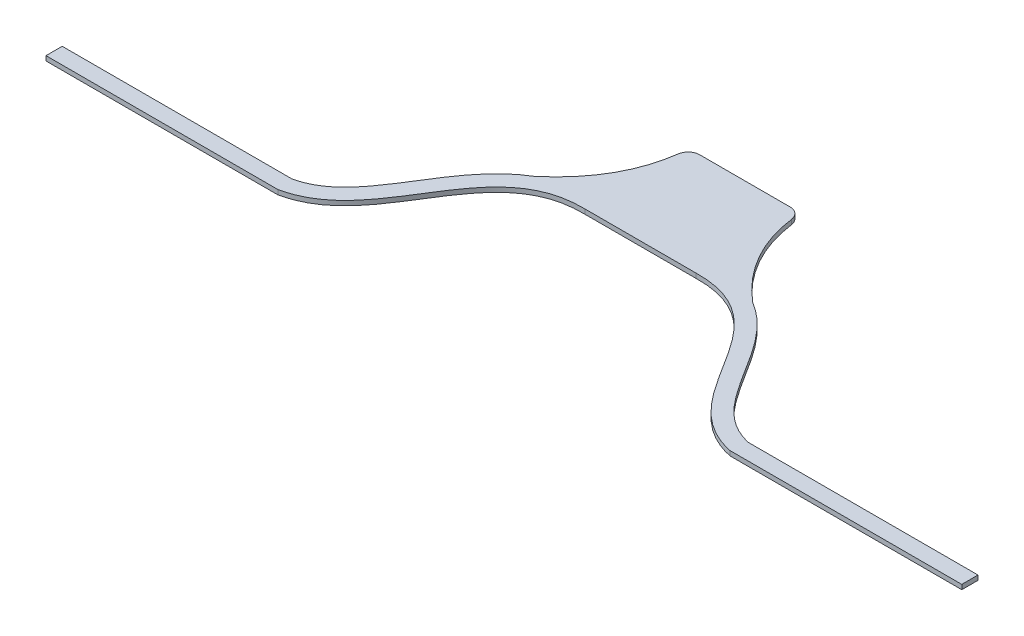
ISO-10303-21;
HEADER;
FILE_DESCRIPTION(('STEP AP214'),'2;1');
FILE_NAME('part.step','',(''),(''),'','','');
FILE_SCHEMA(('AUTOMOTIVE_DESIGN { 1 0 10303 214 1 1 1 1 }'));
ENDSEC;
DATA;
#1=APPLICATION_CONTEXT('core data for automotive mechanical design processes');
#2=APPLICATION_PROTOCOL_DEFINITION('international standard','automotive_design',2000,#1);
#3=PRODUCT_CONTEXT('',#1,'mechanical');
#4=PRODUCT('Part','Part','',(#3));
#5=PRODUCT_RELATED_PRODUCT_CATEGORY('part','',(#4));
#6=PRODUCT_DEFINITION_FORMATION('','',#4);
#7=PRODUCT_DEFINITION_CONTEXT('part definition',#1,'design');
#8=PRODUCT_DEFINITION('design','',#6,#7);
#9=PRODUCT_DEFINITION_SHAPE('','',#8);
#10=(LENGTH_UNIT() NAMED_UNIT(*) SI_UNIT(.MILLI.,.METRE.));
#11=(NAMED_UNIT(*) PLANE_ANGLE_UNIT() SI_UNIT($,.RADIAN.));
#12=(NAMED_UNIT(*) SI_UNIT($,.STERADIAN.) SOLID_ANGLE_UNIT());
#13=UNCERTAINTY_MEASURE_WITH_UNIT(LENGTH_MEASURE(1.E-05),#10,'distance_accuracy_value','');
#14=(GEOMETRIC_REPRESENTATION_CONTEXT(3) GLOBAL_UNCERTAINTY_ASSIGNED_CONTEXT((#13)) GLOBAL_UNIT_ASSIGNED_CONTEXT((#10,
#11,#12)) REPRESENTATION_CONTEXT('',''));
#15=CARTESIAN_POINT('',(0.,0.,0.));
#16=DIRECTION('',(0.,0.,1.));
#17=DIRECTION('',(1.,0.,0.));
#18=AXIS2_PLACEMENT_3D('',#15,#16,#17);
#19=CARTESIAN_POINT('',(24.,2.,-45.));
#20=DIRECTION('',(0.,0.,1.));
#21=DIRECTION('',(1.,0.,0.));
#22=AXIS2_PLACEMENT_3D('',#19,#20,#21);
#23=PLANE('',#22);
#24=DIRECTION('',(-1.,0.,0.));
#25=VECTOR('',#24,1.);
#26=CARTESIAN_POINT('',(24.,0.,-45.));
#27=LINE('',#26,#25);
#28=CARTESIAN_POINT('',(43.488003544072,0.,-45.));
#29=VERTEX_POINT('',#28);
#30=CARTESIAN_POINT('',(4.51199645592805,0.,-45.));
#31=VERTEX_POINT('',#30);
#32=EDGE_CURVE('E231',#29,#31,#27,.T.);
#33=ORIENTED_EDGE('',*,*,#32,.T.);
#34=DIRECTION('',(0.,-1.,0.));
#35=VECTOR('',#34,1.);
#36=CARTESIAN_POINT('',(4.51199645592805,2.,-45.));
#37=LINE('',#36,#35);
#38=CARTESIAN_POINT('',(4.51199645592805,2.,-45.));
#39=VERTEX_POINT('',#38);
#40=EDGE_CURVE('E239',#39,#31,#37,.T.);
#41=ORIENTED_EDGE('',*,*,#40,.F.);
#42=DIRECTION('',(-1.,0.,0.));
#43=VECTOR('',#42,1.);
#44=CARTESIAN_POINT('',(24.,2.,-45.));
#45=LINE('',#44,#43);
#46=CARTESIAN_POINT('',(43.488003544072,2.,-45.));
#47=VERTEX_POINT('',#46);
#48=EDGE_CURVE('E228',#47,#39,#45,.T.);
#49=ORIENTED_EDGE('',*,*,#48,.F.);
#50=DIRECTION('',(0.,-1.,0.));
#51=VECTOR('',#50,1.);
#52=CARTESIAN_POINT('',(43.488003544072,2.,-45.));
#53=LINE('',#52,#51);
#54=EDGE_CURVE('E128',#47,#29,#53,.T.);
#55=ORIENTED_EDGE('',*,*,#54,.T.);
#56=EDGE_LOOP('',(#33,#41,#49,#55));
#57=FACE_BOUND('',#56,.T.);
#58=ADVANCED_FACE('F31',(#57),#23,.F.);
#59=CARTESIAN_POINT('',(24.,2.,0.));
#60=DIRECTION('',(0.,0.,-1.));
#61=DIRECTION('',(-1.,0.,0.));
#62=AXIS2_PLACEMENT_3D('',#59,#60,#61);
#63=PLANE('',#62);
#64=DIRECTION('',(1.,0.,0.));
#65=VECTOR('',#64,1.);
#66=CARTESIAN_POINT('',(24.,0.,0.));
#67=LINE('',#66,#65);
#68=CARTESIAN_POINT('',(0.,0.,0.));
#69=VERTEX_POINT('',#68);
#70=CARTESIAN_POINT('',(48.,0.,0.));
#71=VERTEX_POINT('',#70);
#72=EDGE_CURVE('E208',#69,#71,#67,.T.);
#73=ORIENTED_EDGE('',*,*,#72,.T.);
#74=DIRECTION('',(0.,-1.,0.));
#75=VECTOR('',#74,1.);
#76=CARTESIAN_POINT('',(48.,2.,0.));
#77=LINE('',#76,#75);
#78=CARTESIAN_POINT('',(48.,2.,0.));
#79=VERTEX_POINT('',#78);
#80=EDGE_CURVE('E11',#79,#71,#77,.T.);
#81=ORIENTED_EDGE('',*,*,#80,.F.);
#82=DIRECTION('',(1.,0.,0.));
#83=VECTOR('',#82,1.);
#84=CARTESIAN_POINT('',(24.,2.,0.));
#85=LINE('',#84,#83);
#86=CARTESIAN_POINT('',(0.,2.,0.));
#87=VERTEX_POINT('',#86);
#88=EDGE_CURVE('E91',#87,#79,#85,.T.);
#89=ORIENTED_EDGE('',*,*,#88,.F.);
#90=DIRECTION('',(0.,-1.,0.));
#91=VECTOR('',#90,1.);
#92=CARTESIAN_POINT('',(0.,2.,0.));
#93=LINE('',#92,#91);
#94=EDGE_CURVE('E300',#87,#69,#93,.T.);
#95=ORIENTED_EDGE('',*,*,#94,.T.);
#96=EDGE_LOOP('',(#73,#81,#89,#95));
#97=FACE_BOUND('',#96,.T.);
#98=ADVANCED_FACE('F164',(#97),#63,.F.);
#99=CARTESIAN_POINT('',(48.,2.,0.));
#100=CARTESIAN_POINT('',(89.0993657243685,2.,-0.874773385067467));
#101=CARTESIAN_POINT('',(86.3740590440952,2.,51.6031429830627));
#102=CARTESIAN_POINT('',(121.547837424553,2.,58.9863844066122));
#103=B_SPLINE_CURVE_WITH_KNOTS('',3,(#99,#100,#101,#102),.UNSPECIFIED.,.F.,.F.,(4,4),(0.,1.),.UNSPECIFIED.);
#104=DIRECTION('',(0.,-1.,0.));
#105=VECTOR('',#104,1.);
#106=SURFACE_OF_LINEAR_EXTRUSION('',#103,#105);
#107=CARTESIAN_POINT('',(48.,0.,0.));
#108=CARTESIAN_POINT('',(89.0993657243685,0.,-0.874773385067467));
#109=CARTESIAN_POINT('',(86.3740590440952,0.,51.6031429830627));
#110=CARTESIAN_POINT('',(121.547837424553,0.,58.9863844066122));
#111=B_SPLINE_CURVE_WITH_KNOTS('',3,(#107,#108,#109,#110),.UNSPECIFIED.,.F.,.F.,(4,4),(0.,1.),.UNSPECIFIED.);
#112=CARTESIAN_POINT('',(121.547837424553,0.,58.9863844066122));
#113=VERTEX_POINT('',#112);
#114=EDGE_CURVE('E205',#71,#113,#111,.T.);
#115=ORIENTED_EDGE('',*,*,#114,.T.);
#116=DIRECTION('',(0.,-1.,0.));
#117=VECTOR('',#116,1.);
#118=CARTESIAN_POINT('',(121.547837424553,2.,58.9863844066122));
#119=LINE('',#118,#117);
#120=CARTESIAN_POINT('',(121.547837424553,2.,58.9863844066122));
#121=VERTEX_POINT('',#120);
#122=EDGE_CURVE('E39',#121,#113,#119,.T.);
#123=ORIENTED_EDGE('',*,*,#122,.F.);
#124=EDGE_CURVE('E166',#79,#121,#103,.T.);
#125=ORIENTED_EDGE('',*,*,#124,.F.);
#126=ORIENTED_EDGE('',*,*,#80,.T.);
#127=EDGE_LOOP('',(#115,#123,#125,#126));
#128=FACE_BOUND('',#127,.T.);
#129=ADVANCED_FACE('F160',(#128),#106,.F.);
#130=CARTESIAN_POINT('',(121.547837424553,2.,58.9863844066122));
#131=DIRECTION('',(0.,0.,-1.));
#132=DIRECTION('',(-1.,0.,0.));
#133=AXIS2_PLACEMENT_3D('',#130,#131,#132);
#134=PLANE('',#133);
#135=DIRECTION('',(1.,0.,0.));
#136=VECTOR('',#135,1.);
#137=CARTESIAN_POINT('',(121.547837424553,0.,58.9863844066122));
#138=LINE('',#137,#136);
#139=CARTESIAN_POINT('',(221.547837424553,0.,58.9863844066122));
#140=VERTEX_POINT('',#139);
#141=EDGE_CURVE('E198',#113,#140,#138,.T.);
#142=ORIENTED_EDGE('',*,*,#141,.T.);
#143=DIRECTION('',(0.,-1.,0.));
#144=VECTOR('',#143,1.);
#145=CARTESIAN_POINT('',(221.547837424553,2.,58.9863844066122));
#146=LINE('',#145,#144);
#147=CARTESIAN_POINT('',(221.547837424553,2.,58.9863844066122));
#148=VERTEX_POINT('',#147);
#149=EDGE_CURVE('E189',#148,#140,#146,.T.);
#150=ORIENTED_EDGE('',*,*,#149,.F.);
#151=DIRECTION('',(1.,0.,0.));
#152=VECTOR('',#151,1.);
#153=CARTESIAN_POINT('',(121.547837424553,2.,58.9863844066122));
#154=LINE('',#153,#152);
#155=EDGE_CURVE('E172',#121,#148,#154,.T.);
#156=ORIENTED_EDGE('',*,*,#155,.F.);
#157=ORIENTED_EDGE('',*,*,#122,.T.);
#158=EDGE_LOOP('',(#142,#150,#156,#157));
#159=FACE_BOUND('',#158,.T.);
#160=ADVANCED_FACE('F156',(#159),#134,.F.);
#161=CARTESIAN_POINT('',(221.547837424553,2.,51.9863844066122));
#162=DIRECTION('',(-1.,0.,0.));
#163=DIRECTION('',(0.,0.,1.));
#164=AXIS2_PLACEMENT_3D('',#161,#162,#163);
#165=PLANE('',#164);
#166=DIRECTION('',(0.,0.,-1.));
#167=VECTOR('',#166,1.);
#168=CARTESIAN_POINT('',(221.547837424553,0.,51.9863844066122));
#169=LINE('',#168,#167);
#170=CARTESIAN_POINT('',(221.547837424553,0.,51.9863844066122));
#171=VERTEX_POINT('',#170);
#172=EDGE_CURVE('E187',#140,#171,#169,.T.);
#173=ORIENTED_EDGE('',*,*,#172,.T.);
#174=DIRECTION('',(0.,-1.,0.));
#175=VECTOR('',#174,1.);
#176=CARTESIAN_POINT('',(221.547837424553,2.,51.9863844066122));
#177=LINE('',#176,#175);
#178=CARTESIAN_POINT('',(221.547837424553,2.,51.9863844066122));
#179=VERTEX_POINT('',#178);
#180=EDGE_CURVE('E185',#179,#171,#177,.T.);
#181=ORIENTED_EDGE('',*,*,#180,.F.);
#182=DIRECTION('',(0.,0.,-1.));
#183=VECTOR('',#182,1.);
#184=CARTESIAN_POINT('',(221.547837424553,2.,51.9863844066122));
#185=LINE('',#184,#183);
#186=EDGE_CURVE('E178',#148,#179,#185,.T.);
#187=ORIENTED_EDGE('',*,*,#186,.F.);
#188=ORIENTED_EDGE('',*,*,#149,.T.);
#189=EDGE_LOOP('',(#173,#181,#187,#188));
#190=FACE_BOUND('',#189,.T.);
#191=ADVANCED_FACE('F152',(#190),#165,.F.);
#192=CARTESIAN_POINT('',(122.313023704226,2.,51.9863844066122));
#193=DIRECTION('',(0.,0.,1.));
#194=DIRECTION('',(1.,0.,0.));
#195=AXIS2_PLACEMENT_3D('',#192,#193,#194);
#196=PLANE('',#195);
#197=DIRECTION('',(-1.,0.,0.));
#198=VECTOR('',#197,1.);
#199=CARTESIAN_POINT('',(122.313023704226,0.,51.9863844066122));
#200=LINE('',#199,#198);
#201=CARTESIAN_POINT('',(122.313023704226,0.,51.9863844066122));
#202=VERTEX_POINT('',#201);
#203=EDGE_CURVE('E191',#171,#202,#200,.T.);
#204=ORIENTED_EDGE('',*,*,#203,.T.);
#205=DIRECTION('',(0.,-1.,0.));
#206=VECTOR('',#205,1.);
#207=CARTESIAN_POINT('',(122.313023704226,2.,51.9863844066122));
#208=LINE('',#207,#206);
#209=CARTESIAN_POINT('',(122.313023704226,2.,51.9863844066122));
#210=VERTEX_POINT('',#209);
#211=EDGE_CURVE('E123',#210,#202,#208,.T.);
#212=ORIENTED_EDGE('',*,*,#211,.F.);
#213=DIRECTION('',(-1.,0.,0.));
#214=VECTOR('',#213,1.);
#215=CARTESIAN_POINT('',(122.313023704226,2.,51.9863844066122));
#216=LINE('',#215,#214);
#217=EDGE_CURVE('E114',#179,#210,#216,.T.);
#218=ORIENTED_EDGE('',*,*,#217,.F.);
#219=ORIENTED_EDGE('',*,*,#180,.T.);
#220=EDGE_LOOP('',(#204,#212,#218,#219));
#221=FACE_BOUND('',#220,.T.);
#222=ADVANCED_FACE('F149',(#221),#196,.F.);
#223=CARTESIAN_POINT('',(122.313023704226,2.,51.9863844066123));
#224=CARTESIAN_POINT('',(121.885844489725,2.,51.8864079394672));
#225=CARTESIAN_POINT('',(121.027397164207,2.,51.664895867856));
#226=CARTESIAN_POINT('',(119.399803507077,2.,51.1642480010718));
#227=CARTESIAN_POINT('',(117.47052387142,2.,50.422441408792));
#228=CARTESIAN_POINT('',(115.306224932325,2.,49.3583854062524));
#229=CARTESIAN_POINT('',(112.577236611943,2.,47.7108583593677));
#230=CARTESIAN_POINT('',(109.401002767988,2.,45.2249885337184));
#231=CARTESIAN_POINT('',(105.842816251333,2.,41.5805420740891));
#232=CARTESIAN_POINT('',(102.46973344704,2.,37.3452311949173));
#233=CARTESIAN_POINT('',(98.1298976978819,2.,31.0609289900516));
#234=CARTESIAN_POINT('',(92.8078276018447,2.,22.3475839774523));
#235=CARTESIAN_POINT('',(86.8913645856075,2.,13.4164219739912));
#236=CARTESIAN_POINT('',(81.1896868208179,2.,6.72629636996395));
#237=CARTESIAN_POINT('',(76.2515683908748,2.,2.12151525702767));
#238=CARTESIAN_POINT('',(70.4977940652659,2.,-1.83654102480087));
#239=CARTESIAN_POINT('',(64.9571749478774,2.,-4.36166941338271));
#240=CARTESIAN_POINT('',(60.0875397730113,2.,-5.79250445439016));
#241=CARTESIAN_POINT('',(56.2260013282232,2.,-6.5497021505277));
#242=CARTESIAN_POINT('',(52.8330920605588,2.,-6.90377028711775));
#243=CARTESIAN_POINT('',(50.0255043143018,2.,-7.01582151024889));
#244=CARTESIAN_POINT('',(48.5715073003699,2.,-7.01371404196028));
#245=CARTESIAN_POINT('',(47.8510279842363,2.,-6.99837881931692));
#246=B_SPLINE_CURVE_WITH_KNOTS('',3,(#223,#224,#225,#226,#227,#228,#229,#230,#231,#232,#233,
#234,#235,#236,#237,#238,#239,#240,#241,#242,#243,#244,#245),.UNSPECIFIED.,.F.,.F.,(4,1,1,1,1,1,
1,1,1,1,1,1,1,1,1,1,1,1,1,1,4),(0.,0.0155010474032945,0.0310020948065889,0.0620041896131779,
0.0930062844197669,0.124008379226356,0.186012568839534,0.248016758452712,0.31002094806589,
0.372025137679068,0.496033516905423,0.620041896131779,0.682046085744957,0.744050275358135,
0.806054464971313,0.868058654584491,0.89906074939108,0.930062844197669,0.961064939004258,
0.976565986407552,0.992067033810847),.UNSPECIFIED.);
#247=DIRECTION('',(0.,-1.,0.));
#248=VECTOR('',#247,1.);
#249=SURFACE_OF_LINEAR_EXTRUSION('',#246,#248);
#250=CARTESIAN_POINT('',(122.313023704226,0.,51.9863844066123));
#251=CARTESIAN_POINT('',(121.885844489725,0.,51.8864079394672));
#252=CARTESIAN_POINT('',(121.027397164207,0.,51.664895867856));
#253=CARTESIAN_POINT('',(119.399803507077,0.,51.1642480010718));
#254=CARTESIAN_POINT('',(117.47052387142,0.,50.422441408792));
#255=CARTESIAN_POINT('',(115.306224932325,0.,49.3583854062524));
#256=CARTESIAN_POINT('',(112.577236611943,0.,47.7108583593677));
#257=CARTESIAN_POINT('',(109.401002767988,0.,45.2249885337184));
#258=CARTESIAN_POINT('',(105.842816251333,0.,41.5805420740891));
#259=CARTESIAN_POINT('',(102.46973344704,0.,37.3452311949173));
#260=CARTESIAN_POINT('',(98.1298976978819,0.,31.0609289900516));
#261=CARTESIAN_POINT('',(92.8078276018447,0.,22.3475839774523));
#262=CARTESIAN_POINT('',(86.8913645856075,0.,13.4164219739912));
#263=CARTESIAN_POINT('',(81.1896868208179,0.,6.72629636996395));
#264=CARTESIAN_POINT('',(76.2515683908748,0.,2.12151525702767));
#265=CARTESIAN_POINT('',(70.4977940652659,0.,-1.83654102480087));
#266=CARTESIAN_POINT('',(64.9571749478774,0.,-4.36166941338271));
#267=CARTESIAN_POINT('',(60.0875397730113,0.,-5.79250445439016));
#268=CARTESIAN_POINT('',(56.2260013282232,0.,-6.5497021505277));
#269=CARTESIAN_POINT('',(52.8330920605588,0.,-6.90377028711775));
#270=CARTESIAN_POINT('',(50.0255043143018,0.,-7.01582151024889));
#271=CARTESIAN_POINT('',(48.5715073003699,0.,-7.01371404196028));
#272=CARTESIAN_POINT('',(47.8510279842363,0.,-6.99837881931692));
#273=B_SPLINE_CURVE_WITH_KNOTS('',3,(#250,#251,#252,#253,#254,#255,#256,#257,#258,#259,#260,
#261,#262,#263,#264,#265,#266,#267,#268,#269,#270,#271,#272),.UNSPECIFIED.,.F.,.F.,(4,1,1,1,1,1,
1,1,1,1,1,1,1,1,1,1,1,1,1,1,4),(0.,0.0155010474032945,0.0310020948065889,0.0620041896131779,
0.0930062844197669,0.124008379226356,0.186012568839534,0.248016758452712,0.31002094806589,
0.372025137679068,0.496033516905423,0.620041896131779,0.682046085744957,0.744050275358135,
0.806054464971313,0.868058654584491,0.89906074939108,0.930062844197669,0.961064939004258,
0.976565986407552,0.992067033810847),.UNSPECIFIED.);
#274=CARTESIAN_POINT('',(71.125983178652,0.,-1.23254193857288));
#275=VERTEX_POINT('',#274);
#276=EDGE_CURVE('E122',#202,#275,#273,.T.);
#277=ORIENTED_EDGE('',*,*,#276,.T.);
#278=DIRECTION('',(0.,-1.,0.));
#279=VECTOR('',#278,1.);
#280=CARTESIAN_POINT('',(71.125983178652,2.,-1.23254193857288));
#281=LINE('',#280,#279);
#282=CARTESIAN_POINT('',(71.125983178652,2.,-1.23254193857288));
#283=VERTEX_POINT('',#282);
#284=EDGE_CURVE('E119',#283,#275,#281,.T.);
#285=ORIENTED_EDGE('',*,*,#284,.F.);
#286=EDGE_CURVE('E108',#210,#283,#246,.T.);
#287=ORIENTED_EDGE('',*,*,#286,.F.);
#288=ORIENTED_EDGE('',*,*,#211,.T.);
#289=EDGE_LOOP('',(#277,#285,#287,#288));
#290=FACE_BOUND('',#289,.T.);
#291=ADVANCED_FACE('F120',(#290),#249,.F.);
#292=CARTESIAN_POINT('',(71.125983178652,2.,-1.23254193857288));
#293=CARTESIAN_POINT('',(58.9817518445351,2.,-11.4482778469872));
#294=CARTESIAN_POINT('',(50.6203668207433,2.,-24.4295347486504));
#295=CARTESIAN_POINT('',(48.4436597077135,2.,-40.6644335841237));
#296=B_SPLINE_CURVE_WITH_KNOTS('',3,(#292,#293,#294,#295),.UNSPECIFIED.,.F.,.F.,(4,4),
(0.0803758527137767,1.),.UNSPECIFIED.);
#297=DIRECTION('',(0.,-1.,0.));
#298=VECTOR('',#297,1.);
#299=SURFACE_OF_LINEAR_EXTRUSION('',#296,#298);
#300=CARTESIAN_POINT('',(71.125983178652,0.,-1.23254193857288));
#301=CARTESIAN_POINT('',(58.9817518445351,0.,-11.4482778469872));
#302=CARTESIAN_POINT('',(50.6203668207433,0.,-24.4295347486504));
#303=CARTESIAN_POINT('',(48.4436597077135,0.,-40.6644335841237));
#304=B_SPLINE_CURVE_WITH_KNOTS('',3,(#300,#301,#302,#303),.UNSPECIFIED.,.F.,.F.,(4,4),
(0.0803758527137767,1.),.UNSPECIFIED.);
#305=CARTESIAN_POINT('',(48.4436597077135,0.,-40.6644335841237));
#306=VERTEX_POINT('',#305);
#307=EDGE_CURVE('E77',#275,#306,#304,.T.);
#308=ORIENTED_EDGE('',*,*,#307,.T.);
#309=DIRECTION('',(0.,-1.,0.));
#310=VECTOR('',#309,1.);
#311=CARTESIAN_POINT('',(48.4436597077135,2.,-40.6644335841237));
#312=LINE('',#311,#310);
#313=CARTESIAN_POINT('',(48.4436597077135,2.,-40.6644335841237));
#314=VERTEX_POINT('',#313);
#315=EDGE_CURVE('E124',#314,#306,#312,.T.);
#316=ORIENTED_EDGE('',*,*,#315,.F.);
#317=EDGE_CURVE('E112',#283,#314,#296,.T.);
#318=ORIENTED_EDGE('',*,*,#317,.F.);
#319=ORIENTED_EDGE('',*,*,#284,.T.);
#320=EDGE_LOOP('',(#308,#316,#318,#319));
#321=FACE_BOUND('',#320,.T.);
#322=ADVANCED_FACE('F126',(#321),#299,.F.);
#323=CARTESIAN_POINT('',(43.4880035440669,2.,-40.));
#324=DIRECTION('',(0.,-1.,0.));
#325=DIRECTION('',(0.,0.,-1.));
#326=AXIS2_PLACEMENT_3D('',#323,#324,#325);
#327=CYLINDRICAL_SURFACE('',#326,5.);
#328=CARTESIAN_POINT('',(43.4880035440669,0.,-40.));
#329=DIRECTION('',(0.,1.,0.));
#330=DIRECTION('',(0.,0.,-1.));
#331=AXIS2_PLACEMENT_3D('',#328,#329,#330);
#332=CIRCLE('',#331,5.);
#333=EDGE_CURVE('E83',#306,#29,#332,.T.);
#334=ORIENTED_EDGE('',*,*,#333,.T.);
#335=ORIENTED_EDGE('',*,*,#54,.F.);
#336=CARTESIAN_POINT('',(43.4880035440669,2.,-40.));
#337=DIRECTION('',(0.,1.,0.));
#338=DIRECTION('',(0.,0.,-1.));
#339=AXIS2_PLACEMENT_3D('',#336,#337,#338);
#340=CIRCLE('',#339,5.);
#341=EDGE_CURVE('E47',#314,#47,#340,.T.);
#342=ORIENTED_EDGE('',*,*,#341,.F.);
#343=ORIENTED_EDGE('',*,*,#315,.T.);
#344=EDGE_LOOP('',(#334,#335,#342,#343));
#345=FACE_BOUND('',#344,.T.);
#346=ADVANCED_FACE('F145',(#345),#327,.T.);
#347=CARTESIAN_POINT('',(43.4880035440669,2.,-40.));
#348=DIRECTION('',(0.,-1.,0.));
#349=DIRECTION('',(0.,0.,-1.));
#350=AXIS2_PLACEMENT_3D('',#347,#348,#349);
#351=PLANE('',#350);
#352=ORIENTED_EDGE('',*,*,#48,.T.);
#353=CARTESIAN_POINT('',(4.51199645593311,2.,-40.));
#354=DIRECTION('',(0.,-1.,0.));
#355=DIRECTION('',(0.,0.,-1.));
#356=AXIS2_PLACEMENT_3D('',#353,#354,#355);
#357=CIRCLE('',#356,5.);
#358=CARTESIAN_POINT('',(-0.443659707713491,2.,-40.6644335841237));
#359=VERTEX_POINT('',#358);
#360=EDGE_CURVE('E253',#359,#39,#357,.T.);
#361=ORIENTED_EDGE('',*,*,#360,.F.);
#362=CARTESIAN_POINT('',(-23.125983178652,2.,-1.23254193857288));
#363=CARTESIAN_POINT('',(-10.9817518445351,2.,-11.4482778469872));
#364=CARTESIAN_POINT('',(-2.6203668207433,2.,-24.4295347486504));
#365=CARTESIAN_POINT('',(-0.443659707713491,2.,-40.6644335841237));
#366=B_SPLINE_CURVE_WITH_KNOTS('',3,(#362,#363,#364,#365),.UNSPECIFIED.,.F.,.F.,(4,4),
(0.0803758527137767,1.),.UNSPECIFIED.);
#367=CARTESIAN_POINT('',(-23.125983178652,2.,-1.23254193857288));
#368=VERTEX_POINT('',#367);
#369=EDGE_CURVE('E258',#368,#359,#366,.T.);
#370=ORIENTED_EDGE('',*,*,#369,.F.);
#371=CARTESIAN_POINT('',(-74.3130237042258,2.,51.9863844066123));
#372=CARTESIAN_POINT('',(-73.8858444897246,2.,51.8864079394672));
#373=CARTESIAN_POINT('',(-73.0273971642065,2.,51.664895867856));
#374=CARTESIAN_POINT('',(-71.3998035070768,2.,51.1642480010718));
#375=CARTESIAN_POINT('',(-69.4705238714202,2.,50.422441408792));
#376=CARTESIAN_POINT('',(-67.3062249323245,2.,49.3583854062524));
#377=CARTESIAN_POINT('',(-64.5772366119434,2.,47.7108583593677));
#378=CARTESIAN_POINT('',(-61.4010027679882,2.,45.2249885337184));
#379=CARTESIAN_POINT('',(-57.842816251333,2.,41.5805420740891));
#380=CARTESIAN_POINT('',(-54.46973344704,2.,37.3452311949173));
#381=CARTESIAN_POINT('',(-50.1298976978819,2.,31.0609289900516));
#382=CARTESIAN_POINT('',(-44.8078276018447,2.,22.3475839774523));
#383=CARTESIAN_POINT('',(-38.8913645856075,2.,13.4164219739912));
#384=CARTESIAN_POINT('',(-33.1896868208179,2.,6.72629636996395));
#385=CARTESIAN_POINT('',(-28.2515683908748,2.,2.12151525702767));
#386=CARTESIAN_POINT('',(-22.4977940652659,2.,-1.83654102480087));
#387=CARTESIAN_POINT('',(-16.9571749478774,2.,-4.36166941338271));
#388=CARTESIAN_POINT('',(-12.0875397730113,2.,-5.79250445439016));
#389=CARTESIAN_POINT('',(-8.22600132822323,2.,-6.5497021505277));
#390=CARTESIAN_POINT('',(-4.83309206055883,2.,-6.90377028711775));
#391=CARTESIAN_POINT('',(-2.0255043143018,2.,-7.01582151024889));
#392=CARTESIAN_POINT('',(-0.571507300369936,2.,-7.01371404196028));
#393=CARTESIAN_POINT('',(0.148972015763707,2.,-6.99837881931692));
#394=B_SPLINE_CURVE_WITH_KNOTS('',3,(#371,#372,#373,#374,#375,#376,#377,#378,#379,#380,#381,
#382,#383,#384,#385,#386,#387,#388,#389,#390,#391,#392,#393),.UNSPECIFIED.,.F.,.F.,(4,1,1,1,1,1,
1,1,1,1,1,1,1,1,1,1,1,1,1,1,4),(0.,0.0155010474032945,0.0310020948065889,0.0620041896131779,
0.0930062844197669,0.124008379226356,0.186012568839534,0.248016758452712,0.31002094806589,
0.372025137679068,0.496033516905423,0.620041896131779,0.682046085744957,0.744050275358135,
0.806054464971313,0.868058654584491,0.89906074939108,0.930062844197669,0.961064939004258,
0.976565986407552,0.992067033810847),.UNSPECIFIED.);
#395=CARTESIAN_POINT('',(-74.3130237042258,2.,51.9863844066122));
#396=VERTEX_POINT('',#395);
#397=EDGE_CURVE('E261',#396,#368,#394,.T.);
#398=ORIENTED_EDGE('',*,*,#397,.F.);
#399=DIRECTION('',(1.,0.,0.));
#400=VECTOR('',#399,1.);
#401=CARTESIAN_POINT('',(-74.3130237042258,2.,51.9863844066122));
#402=LINE('',#401,#400);
#403=CARTESIAN_POINT('',(-173.547837424553,2.,51.9863844066122));
#404=VERTEX_POINT('',#403);
#405=EDGE_CURVE('E351',#404,#396,#402,.T.);
#406=ORIENTED_EDGE('',*,*,#405,.F.);
#407=DIRECTION('',(0.,0.,-1.));
#408=VECTOR('',#407,1.);
#409=CARTESIAN_POINT('',(-173.547837424553,2.,51.9863844066122));
#410=LINE('',#409,#408);
#411=CARTESIAN_POINT('',(-173.547837424553,2.,58.9863844066122));
#412=VERTEX_POINT('',#411);
#413=EDGE_CURVE('E352',#412,#404,#410,.T.);
#414=ORIENTED_EDGE('',*,*,#413,.F.);
#415=DIRECTION('',(-1.,0.,0.));
#416=VECTOR('',#415,1.);
#417=CARTESIAN_POINT('',(-73.5478374245526,2.,58.9863844066122));
#418=LINE('',#417,#416);
#419=CARTESIAN_POINT('',(-73.5478374245526,2.,58.9863844066122));
#420=VERTEX_POINT('',#419);
#421=EDGE_CURVE('E355',#420,#412,#418,.T.);
#422=ORIENTED_EDGE('',*,*,#421,.F.);
#423=CARTESIAN_POINT('',(0.,2.,0.));
#424=CARTESIAN_POINT('',(-41.0993657243685,2.,-0.874773385067467));
#425=CARTESIAN_POINT('',(-38.3740590440952,2.,51.6031429830627));
#426=CARTESIAN_POINT('',(-73.5478374245526,2.,58.9863844066122));
#427=B_SPLINE_CURVE_WITH_KNOTS('',3,(#423,#424,#425,#426),.UNSPECIFIED.,.F.,.F.,(4,4),(0.,1.),.UNSPECIFIED.);
#428=EDGE_CURVE('E360',#87,#420,#427,.T.);
#429=ORIENTED_EDGE('',*,*,#428,.F.);
#430=ORIENTED_EDGE('',*,*,#88,.T.);
#431=ORIENTED_EDGE('',*,*,#124,.T.);
#432=ORIENTED_EDGE('',*,*,#155,.T.);
#433=ORIENTED_EDGE('',*,*,#186,.T.);
#434=ORIENTED_EDGE('',*,*,#217,.T.);
#435=ORIENTED_EDGE('',*,*,#286,.T.);
#436=ORIENTED_EDGE('',*,*,#317,.T.);
#437=ORIENTED_EDGE('',*,*,#341,.T.);
#438=EDGE_LOOP('',(#352,#361,#370,#398,#406,#414,#422,#429,#430,#431,#432,#433,#434,#435,#436,#437));
#439=FACE_BOUND('',#438,.T.);
#440=ADVANCED_FACE('F110',(#439),#351,.F.);
#441=CARTESIAN_POINT('',(43.4880035440669,0.,-40.));
#442=DIRECTION('',(0.,-1.,0.));
#443=DIRECTION('',(0.,0.,-1.));
#444=AXIS2_PLACEMENT_3D('',#441,#442,#443);
#445=PLANE('',#444);
#446=ORIENTED_EDGE('',*,*,#32,.F.);
#447=ORIENTED_EDGE('',*,*,#333,.F.);
#448=ORIENTED_EDGE('',*,*,#307,.F.);
#449=ORIENTED_EDGE('',*,*,#276,.F.);
#450=ORIENTED_EDGE('',*,*,#203,.F.);
#451=ORIENTED_EDGE('',*,*,#172,.F.);
#452=ORIENTED_EDGE('',*,*,#141,.F.);
#453=ORIENTED_EDGE('',*,*,#114,.F.);
#454=ORIENTED_EDGE('',*,*,#72,.F.);
#455=CARTESIAN_POINT('',(0.,0.,0.));
#456=CARTESIAN_POINT('',(-41.0993657243685,0.,-0.874773385067467));
#457=CARTESIAN_POINT('',(-38.3740590440952,0.,51.6031429830627));
#458=CARTESIAN_POINT('',(-73.5478374245526,0.,58.9863844066122));
#459=B_SPLINE_CURVE_WITH_KNOTS('',3,(#455,#456,#457,#458),.UNSPECIFIED.,.F.,.F.,(4,4),(0.,1.),.UNSPECIFIED.);
#460=CARTESIAN_POINT('',(-73.5478374245526,0.,58.9863844066122));
#461=VERTEX_POINT('',#460);
#462=EDGE_CURVE('E259',#69,#461,#459,.T.);
#463=ORIENTED_EDGE('',*,*,#462,.T.);
#464=DIRECTION('',(-1.,0.,0.));
#465=VECTOR('',#464,1.);
#466=CARTESIAN_POINT('',(-73.5478374245526,0.,58.9863844066122));
#467=LINE('',#466,#465);
#468=CARTESIAN_POINT('',(-173.547837424553,0.,58.9863844066122));
#469=VERTEX_POINT('',#468);
#470=EDGE_CURVE('E264',#461,#469,#467,.T.);
#471=ORIENTED_EDGE('',*,*,#470,.T.);
#472=DIRECTION('',(0.,0.,-1.));
#473=VECTOR('',#472,1.);
#474=CARTESIAN_POINT('',(-173.547837424553,0.,51.9863844066122));
#475=LINE('',#474,#473);
#476=CARTESIAN_POINT('',(-173.547837424553,0.,51.9863844066122));
#477=VERTEX_POINT('',#476);
#478=EDGE_CURVE('E390',#469,#477,#475,.T.);
#479=ORIENTED_EDGE('',*,*,#478,.T.);
#480=DIRECTION('',(1.,0.,0.));
#481=VECTOR('',#480,1.);
#482=CARTESIAN_POINT('',(-74.3130237042258,0.,51.9863844066122));
#483=LINE('',#482,#481);
#484=CARTESIAN_POINT('',(-74.3130237042258,0.,51.9863844066122));
#485=VERTEX_POINT('',#484);
#486=EDGE_CURVE('E387',#477,#485,#483,.T.);
#487=ORIENTED_EDGE('',*,*,#486,.T.);
#488=CARTESIAN_POINT('',(-74.3130237042258,0.,51.9863844066123));
#489=CARTESIAN_POINT('',(-73.8858444897246,0.,51.8864079394672));
#490=CARTESIAN_POINT('',(-73.0273971642065,0.,51.664895867856));
#491=CARTESIAN_POINT('',(-71.3998035070768,0.,51.1642480010718));
#492=CARTESIAN_POINT('',(-69.4705238714202,0.,50.422441408792));
#493=CARTESIAN_POINT('',(-67.3062249323245,0.,49.3583854062524));
#494=CARTESIAN_POINT('',(-64.5772366119434,0.,47.7108583593677));
#495=CARTESIAN_POINT('',(-61.4010027679882,0.,45.2249885337184));
#496=CARTESIAN_POINT('',(-57.842816251333,0.,41.5805420740891));
#497=CARTESIAN_POINT('',(-54.46973344704,0.,37.3452311949173));
#498=CARTESIAN_POINT('',(-50.1298976978819,0.,31.0609289900516));
#499=CARTESIAN_POINT('',(-44.8078276018447,0.,22.3475839774523));
#500=CARTESIAN_POINT('',(-38.8913645856075,0.,13.4164219739912));
#501=CARTESIAN_POINT('',(-33.1896868208179,0.,6.72629636996395));
#502=CARTESIAN_POINT('',(-28.2515683908748,0.,2.12151525702767));
#503=CARTESIAN_POINT('',(-22.4977940652659,0.,-1.83654102480087));
#504=CARTESIAN_POINT('',(-16.9571749478774,0.,-4.36166941338271));
#505=CARTESIAN_POINT('',(-12.0875397730113,0.,-5.79250445439016));
#506=CARTESIAN_POINT('',(-8.22600132822323,0.,-6.5497021505277));
#507=CARTESIAN_POINT('',(-4.83309206055883,0.,-6.90377028711775));
#508=CARTESIAN_POINT('',(-2.0255043143018,0.,-7.01582151024889));
#509=CARTESIAN_POINT('',(-0.571507300369936,0.,-7.01371404196028));
#510=CARTESIAN_POINT('',(0.148972015763707,0.,-6.99837881931692));
#511=B_SPLINE_CURVE_WITH_KNOTS('',3,(#488,#489,#490,#491,#492,#493,#494,#495,#496,#497,#498,
#499,#500,#501,#502,#503,#504,#505,#506,#507,#508,#509,#510),.UNSPECIFIED.,.F.,.F.,(4,1,1,1,1,1,
1,1,1,1,1,1,1,1,1,1,1,1,1,1,4),(0.,0.0155010474032945,0.0310020948065889,0.0620041896131779,
0.0930062844197669,0.124008379226356,0.186012568839534,0.248016758452712,0.31002094806589,
0.372025137679068,0.496033516905423,0.620041896131779,0.682046085744957,0.744050275358135,
0.806054464971313,0.868058654584491,0.89906074939108,0.930062844197669,0.961064939004258,
0.976565986407552,0.992067033810847),.UNSPECIFIED.);
#512=CARTESIAN_POINT('',(-23.125983178652,0.,-1.23254193857288));
#513=VERTEX_POINT('',#512);
#514=EDGE_CURVE('E391',#485,#513,#511,.T.);
#515=ORIENTED_EDGE('',*,*,#514,.T.);
#516=CARTESIAN_POINT('',(-23.125983178652,0.,-1.23254193857288));
#517=CARTESIAN_POINT('',(-10.9817518445351,0.,-11.4482778469872));
#518=CARTESIAN_POINT('',(-2.6203668207433,0.,-24.4295347486504));
#519=CARTESIAN_POINT('',(-0.443659707713491,0.,-40.6644335841237));
#520=B_SPLINE_CURVE_WITH_KNOTS('',3,(#516,#517,#518,#519),.UNSPECIFIED.,.F.,.F.,(4,4),
(0.0803758527137767,1.),.UNSPECIFIED.);
#521=CARTESIAN_POINT('',(-0.443659707713491,0.,-40.6644335841237));
#522=VERTEX_POINT('',#521);
#523=EDGE_CURVE('E342',#513,#522,#520,.T.);
#524=ORIENTED_EDGE('',*,*,#523,.T.);
#525=CARTESIAN_POINT('',(4.51199645593311,0.,-40.));
#526=DIRECTION('',(0.,-1.,0.));
#527=DIRECTION('',(0.,0.,-1.));
#528=AXIS2_PLACEMENT_3D('',#525,#526,#527);
#529=CIRCLE('',#528,5.);
#530=EDGE_CURVE('E235',#522,#31,#529,.T.);
#531=ORIENTED_EDGE('',*,*,#530,.T.);
#532=EDGE_LOOP('',(#446,#447,#448,#449,#450,#451,#452,#453,#454,#463,#471,#479,#487,#515,#524,#531));
#533=FACE_BOUND('',#532,.T.);
#534=ADVANCED_FACE('F203',(#533),#445,.T.);
#535=CARTESIAN_POINT('',(4.51199645593311,2.,-40.));
#536=DIRECTION('',(0.,-1.,0.));
#537=DIRECTION('',(0.,0.,-1.));
#538=AXIS2_PLACEMENT_3D('',#535,#536,#537);
#539=CYLINDRICAL_SURFACE('',#538,5.);
#540=ORIENTED_EDGE('',*,*,#530,.F.);
#541=DIRECTION('',(0.,-1.,0.));
#542=VECTOR('',#541,1.);
#543=CARTESIAN_POINT('',(-0.443659707713491,2.,-40.6644335841237));
#544=LINE('',#543,#542);
#545=EDGE_CURVE('E240',#359,#522,#544,.T.);
#546=ORIENTED_EDGE('',*,*,#545,.F.);
#547=ORIENTED_EDGE('',*,*,#360,.T.);
#548=ORIENTED_EDGE('',*,*,#40,.T.);
#549=EDGE_LOOP('',(#540,#546,#547,#548));
#550=FACE_BOUND('',#549,.T.);
#551=ADVANCED_FACE('F257',(#550),#539,.T.);
#552=DIRECTION('',(0.,-1.,0.));
#553=VECTOR('',#552,1.);
#554=SURFACE_OF_LINEAR_EXTRUSION('',#366,#553);
#555=ORIENTED_EDGE('',*,*,#523,.F.);
#556=DIRECTION('',(0.,-1.,0.));
#557=VECTOR('',#556,1.);
#558=CARTESIAN_POINT('',(-23.125983178652,2.,-1.23254193857288));
#559=LINE('',#558,#557);
#560=EDGE_CURVE('E245',#368,#513,#559,.T.);
#561=ORIENTED_EDGE('',*,*,#560,.F.);
#562=ORIENTED_EDGE('',*,*,#369,.T.);
#563=ORIENTED_EDGE('',*,*,#545,.T.);
#564=EDGE_LOOP('',(#555,#561,#562,#563));
#565=FACE_BOUND('',#564,.T.);
#566=ADVANCED_FACE('F278',(#565),#554,.T.);
#567=DIRECTION('',(0.,-1.,0.));
#568=VECTOR('',#567,1.);
#569=SURFACE_OF_LINEAR_EXTRUSION('',#394,#568);
#570=ORIENTED_EDGE('',*,*,#514,.F.);
#571=DIRECTION('',(0.,-1.,0.));
#572=VECTOR('',#571,1.);
#573=CARTESIAN_POINT('',(-74.3130237042258,2.,51.9863844066122));
#574=LINE('',#573,#572);
#575=EDGE_CURVE('E347',#396,#485,#574,.T.);
#576=ORIENTED_EDGE('',*,*,#575,.F.);
#577=ORIENTED_EDGE('',*,*,#397,.T.);
#578=ORIENTED_EDGE('',*,*,#560,.T.);
#579=EDGE_LOOP('',(#570,#576,#577,#578));
#580=FACE_BOUND('',#579,.T.);
#581=ADVANCED_FACE('F282',(#580),#569,.T.);
#582=CARTESIAN_POINT('',(-74.3130237042258,2.,51.9863844066122));
#583=DIRECTION('',(0.,0.,-1.));
#584=DIRECTION('',(-1.,0.,0.));
#585=AXIS2_PLACEMENT_3D('',#582,#583,#584);
#586=PLANE('',#585);
#587=ORIENTED_EDGE('',*,*,#486,.F.);
#588=DIRECTION('',(0.,-1.,0.));
#589=VECTOR('',#588,1.);
#590=CARTESIAN_POINT('',(-173.547837424553,2.,51.9863844066122));
#591=LINE('',#590,#589);
#592=EDGE_CURVE('E389',#404,#477,#591,.T.);
#593=ORIENTED_EDGE('',*,*,#592,.F.);
#594=ORIENTED_EDGE('',*,*,#405,.T.);
#595=ORIENTED_EDGE('',*,*,#575,.T.);
#596=EDGE_LOOP('',(#587,#593,#594,#595));
#597=FACE_BOUND('',#596,.T.);
#598=ADVANCED_FACE('F379',(#597),#586,.T.);
#599=CARTESIAN_POINT('',(-173.547837424553,2.,51.9863844066122));
#600=DIRECTION('',(-1.,0.,0.));
#601=DIRECTION('',(0.,0.,1.));
#602=AXIS2_PLACEMENT_3D('',#599,#600,#601);
#603=PLANE('',#602);
#604=ORIENTED_EDGE('',*,*,#478,.F.);
#605=DIRECTION('',(0.,-1.,0.));
#606=VECTOR('',#605,1.);
#607=CARTESIAN_POINT('',(-173.547837424553,2.,58.9863844066122));
#608=LINE('',#607,#606);
#609=EDGE_CURVE('E405',#412,#469,#608,.T.);
#610=ORIENTED_EDGE('',*,*,#609,.F.);
#611=ORIENTED_EDGE('',*,*,#413,.T.);
#612=ORIENTED_EDGE('',*,*,#592,.T.);
#613=EDGE_LOOP('',(#604,#610,#611,#612));
#614=FACE_BOUND('',#613,.T.);
#615=ADVANCED_FACE('F376',(#614),#603,.T.);
#616=CARTESIAN_POINT('',(-73.5478374245526,2.,58.9863844066122));
#617=DIRECTION('',(0.,0.,1.));
#618=DIRECTION('',(1.,0.,0.));
#619=AXIS2_PLACEMENT_3D('',#616,#617,#618);
#620=PLANE('',#619);
#621=ORIENTED_EDGE('',*,*,#470,.F.);
#622=DIRECTION('',(0.,-1.,0.));
#623=VECTOR('',#622,1.);
#624=CARTESIAN_POINT('',(-73.5478374245526,2.,58.9863844066122));
#625=LINE('',#624,#623);
#626=EDGE_CURVE('E309',#420,#461,#625,.T.);
#627=ORIENTED_EDGE('',*,*,#626,.F.);
#628=ORIENTED_EDGE('',*,*,#421,.T.);
#629=ORIENTED_EDGE('',*,*,#609,.T.);
#630=EDGE_LOOP('',(#621,#627,#628,#629));
#631=FACE_BOUND('',#630,.T.);
#632=ADVANCED_FACE('F373',(#631),#620,.T.);
#633=DIRECTION('',(0.,-1.,0.));
#634=VECTOR('',#633,1.);
#635=SURFACE_OF_LINEAR_EXTRUSION('',#427,#634);
#636=ORIENTED_EDGE('',*,*,#462,.F.);
#637=ORIENTED_EDGE('',*,*,#94,.F.);
#638=ORIENTED_EDGE('',*,*,#428,.T.);
#639=ORIENTED_EDGE('',*,*,#626,.T.);
#640=EDGE_LOOP('',(#636,#637,#638,#639));
#641=FACE_BOUND('',#640,.T.);
#642=ADVANCED_FACE('F370',(#641),#635,.T.);
#643=CLOSED_SHELL('',(#58,#98,#129,#160,#191,#222,#291,#322,#346,#440,#534,#551,#566,#581,#598,
#615,#632,#642));
#644=MANIFOLD_SOLID_BREP('B2',#643);
#645=ADVANCED_BREP_SHAPE_REPRESENTATION('',(#18,#644),#14);
#646=SHAPE_DEFINITION_REPRESENTATION(#9,#645);
ENDSEC;
END-ISO-10303-21;
